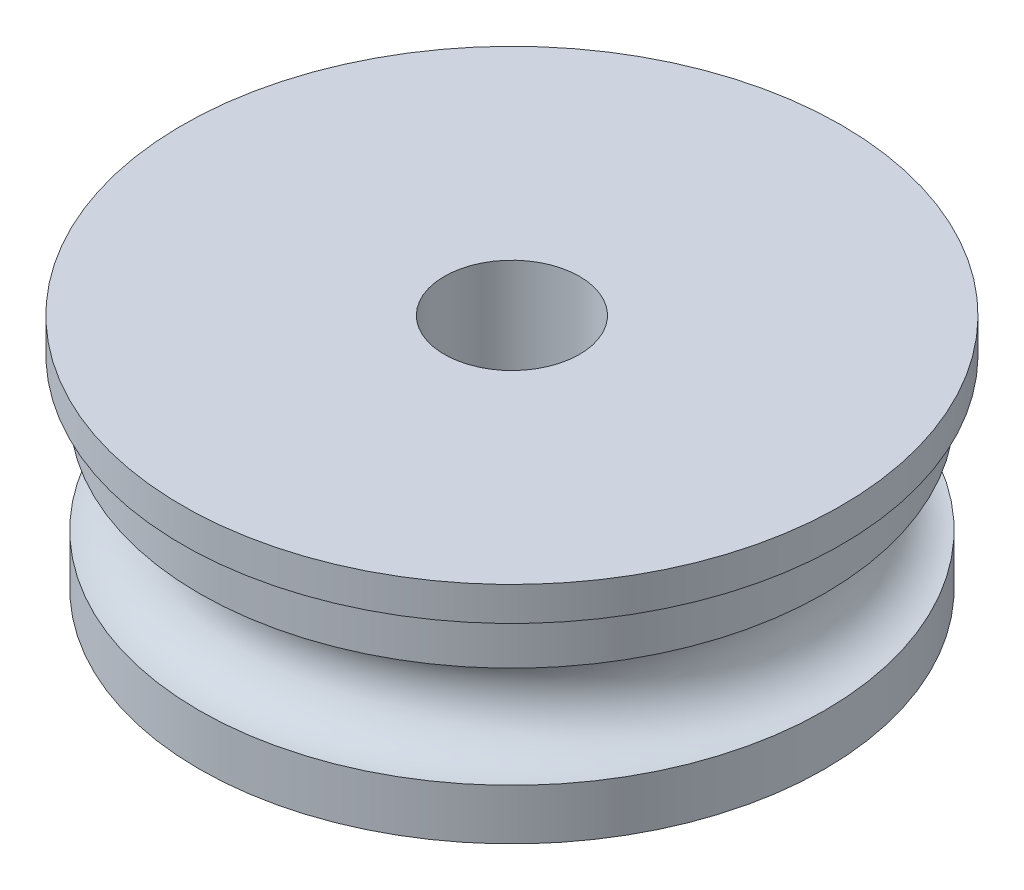
ISO-10303-21;
HEADER;
FILE_DESCRIPTION(('STEP AP214'),'2;1');
FILE_NAME('part.step','',(''),(''),'','','');
FILE_SCHEMA(('AUTOMOTIVE_DESIGN { 1 0 10303 214 1 1 1 1 }'));
ENDSEC;
DATA;
#1=APPLICATION_CONTEXT('core data for automotive mechanical design processes');
#2=APPLICATION_PROTOCOL_DEFINITION('international standard','automotive_design',2000,#1);
#3=PRODUCT_CONTEXT('',#1,'mechanical');
#4=PRODUCT('Part','Part','',(#3));
#5=PRODUCT_RELATED_PRODUCT_CATEGORY('part','',(#4));
#6=PRODUCT_DEFINITION_FORMATION('','',#4);
#7=PRODUCT_DEFINITION_CONTEXT('part definition',#1,'design');
#8=PRODUCT_DEFINITION('design','',#6,#7);
#9=PRODUCT_DEFINITION_SHAPE('','',#8);
#10=(LENGTH_UNIT() NAMED_UNIT(*) SI_UNIT(.MILLI.,.METRE.));
#11=(NAMED_UNIT(*) PLANE_ANGLE_UNIT() SI_UNIT($,.RADIAN.));
#12=(NAMED_UNIT(*) SI_UNIT($,.STERADIAN.) SOLID_ANGLE_UNIT());
#13=UNCERTAINTY_MEASURE_WITH_UNIT(LENGTH_MEASURE(1.E-05),#10,'distance_accuracy_value','');
#14=(GEOMETRIC_REPRESENTATION_CONTEXT(3) GLOBAL_UNCERTAINTY_ASSIGNED_CONTEXT((#13)) GLOBAL_UNIT_ASSIGNED_CONTEXT((#10,
#11,#12)) REPRESENTATION_CONTEXT('',''));
#15=CARTESIAN_POINT('',(0.,0.,0.));
#16=DIRECTION('',(0.,0.,1.));
#17=DIRECTION('',(1.,0.,0.));
#18=AXIS2_PLACEMENT_3D('',#15,#16,#17);
#19=CARTESIAN_POINT('',(6.,0.,0.));
#20=DIRECTION('',(0.,-1.,0.));
#21=DIRECTION('',(0.,0.,-1.));
#22=AXIS2_PLACEMENT_3D('',#19,#20,#21);
#23=PLANE('',#22);
#24=CARTESIAN_POINT('',(0.,0.,0.));
#25=DIRECTION('',(0.,-1.,0.));
#26=DIRECTION('',(0.,0.,-1.));
#27=AXIS2_PLACEMENT_3D('',#24,#25,#26);
#28=CIRCLE('',#27,6.);
#29=CARTESIAN_POINT('',(0.,0.,-6.));
#30=VERTEX_POINT('',#29);
#31=EDGE_CURVE('E10',#30,#30,#28,.T.);
#32=ORIENTED_EDGE('',*,*,#31,.T.);
#33=EDGE_LOOP('',(#32));
#34=FACE_BOUND('',#33,.T.);
#35=CARTESIAN_POINT('',(0.,0.,0.));
#36=DIRECTION('',(0.,-1.,0.));
#37=DIRECTION('',(0.,0.,-1.));
#38=AXIS2_PLACEMENT_3D('',#35,#36,#37);
#39=CIRCLE('',#38,2.);
#40=CARTESIAN_POINT('',(0.,0.,-2.));
#41=VERTEX_POINT('',#40);
#42=EDGE_CURVE('E65',#41,#41,#39,.T.);
#43=ORIENTED_EDGE('',*,*,#42,.F.);
#44=EDGE_LOOP('',(#43));
#45=FACE_BOUND('',#44,.T.);
#46=ADVANCED_FACE('F31',(#34,#45),#23,.T.);
#47=CARTESIAN_POINT('',(0.,0.,0.));
#48=DIRECTION('',(0.,-1.,0.));
#49=DIRECTION('',(0.,0.,-1.));
#50=AXIS2_PLACEMENT_3D('',#47,#48,#49);
#51=CYLINDRICAL_SURFACE('',#50,6.);
#52=CARTESIAN_POINT('',(0.,-3.,0.));
#53=DIRECTION('',(0.,-1.,0.));
#54=DIRECTION('',(0.,0.,-1.));
#55=AXIS2_PLACEMENT_3D('',#52,#53,#54);
#56=CIRCLE('',#55,6.);
#57=CARTESIAN_POINT('',(0.,-3.,-6.));
#58=VERTEX_POINT('',#57);
#59=EDGE_CURVE('E37',#58,#58,#56,.T.);
#60=ORIENTED_EDGE('',*,*,#59,.T.);
#61=EDGE_LOOP('',(#60));
#62=FACE_BOUND('',#61,.T.);
#63=ORIENTED_EDGE('',*,*,#31,.F.);
#64=EDGE_LOOP('',(#63));
#65=FACE_BOUND('',#64,.T.);
#66=ADVANCED_FACE('F73',(#62,#65),#51,.F.);
#67=CARTESIAN_POINT('',(9.25,-3.,0.));
#68=DIRECTION('',(0.,-1.,0.));
#69=DIRECTION('',(0.,0.,-1.));
#70=AXIS2_PLACEMENT_3D('',#67,#68,#69);
#71=PLANE('',#70);
#72=CARTESIAN_POINT('',(0.,-3.,0.));
#73=DIRECTION('',(0.,-1.,0.));
#74=DIRECTION('',(0.,0.,-1.));
#75=AXIS2_PLACEMENT_3D('',#72,#73,#74);
#76=CIRCLE('',#75,9.25);
#77=CARTESIAN_POINT('',(0.,-3.,-9.25));
#78=VERTEX_POINT('',#77);
#79=EDGE_CURVE('E41',#78,#78,#76,.T.);
#80=ORIENTED_EDGE('',*,*,#79,.T.);
#81=EDGE_LOOP('',(#80));
#82=FACE_BOUND('',#81,.T.);
#83=ORIENTED_EDGE('',*,*,#59,.F.);
#84=EDGE_LOOP('',(#83));
#85=FACE_BOUND('',#84,.T.);
#86=ADVANCED_FACE('F77',(#82,#85),#71,.T.);
#87=CARTESIAN_POINT('',(0.,0.,0.));
#88=DIRECTION('',(0.,-1.,0.));
#89=DIRECTION('',(0.,0.,-1.));
#90=AXIS2_PLACEMENT_3D('',#87,#88,#89);
#91=CYLINDRICAL_SURFACE('',#90,9.25);
#92=CARTESIAN_POINT('',(0.,-1.5,0.));
#93=DIRECTION('',(0.,-1.,0.));
#94=DIRECTION('',(0.,0.,-1.));
#95=AXIS2_PLACEMENT_3D('',#92,#93,#94);
#96=CIRCLE('',#95,9.25);
#97=CARTESIAN_POINT('',(0.,-1.5,-9.25));
#98=VERTEX_POINT('',#97);
#99=EDGE_CURVE('E45',#98,#98,#96,.T.);
#100=ORIENTED_EDGE('',*,*,#99,.T.);
#101=EDGE_LOOP('',(#100));
#102=FACE_BOUND('',#101,.T.);
#103=ORIENTED_EDGE('',*,*,#79,.F.);
#104=EDGE_LOOP('',(#103));
#105=FACE_BOUND('',#104,.T.);
#106=ADVANCED_FACE('F81',(#102,#105),#91,.T.);
#107=CARTESIAN_POINT('',(0.,0.,0.));
#108=DIRECTION('',(0.,-1.,0.));
#109=DIRECTION('',(0.,0.,-1.));
#110=AXIS2_PLACEMENT_3D('',#107,#108,#109);
#111=TOROIDAL_SURFACE('',#110,9.25,1.5);
#112=CARTESIAN_POINT('',(0.,1.5,0.));
#113=DIRECTION('',(0.,-1.,0.));
#114=DIRECTION('',(0.,0.,-1.));
#115=AXIS2_PLACEMENT_3D('',#112,#113,#114);
#116=CIRCLE('',#115,9.25);
#117=CARTESIAN_POINT('',(0.,1.5,-9.25));
#118=VERTEX_POINT('',#117);
#119=EDGE_CURVE('E50',#118,#118,#116,.T.);
#120=ORIENTED_EDGE('',*,*,#119,.T.);
#121=EDGE_LOOP('',(#120));
#122=FACE_BOUND('',#121,.T.);
#123=ORIENTED_EDGE('',*,*,#99,.F.);
#124=EDGE_LOOP('',(#123));
#125=FACE_BOUND('',#124,.T.);
#126=ADVANCED_FACE('F88',(#122,#125),#111,.F.);
#127=CARTESIAN_POINT('',(0.,0.,0.));
#128=DIRECTION('',(0.,-1.,0.));
#129=DIRECTION('',(0.,0.,-1.));
#130=AXIS2_PLACEMENT_3D('',#127,#128,#129);
#131=CYLINDRICAL_SURFACE('',#130,9.25);
#132=CARTESIAN_POINT('',(0.,3.,0.));
#133=DIRECTION('',(0.,-1.,0.));
#134=DIRECTION('',(0.,0.,-1.));
#135=AXIS2_PLACEMENT_3D('',#132,#133,#134);
#136=CIRCLE('',#135,9.25);
#137=CARTESIAN_POINT('',(0.,3.,-9.25));
#138=VERTEX_POINT('',#137);
#139=EDGE_CURVE('E53',#138,#138,#136,.T.);
#140=ORIENTED_EDGE('',*,*,#139,.T.);
#141=EDGE_LOOP('',(#140));
#142=FACE_BOUND('',#141,.T.);
#143=ORIENTED_EDGE('',*,*,#119,.F.);
#144=EDGE_LOOP('',(#143));
#145=FACE_BOUND('',#144,.T.);
#146=ADVANCED_FACE('F92',(#142,#145),#131,.T.);
#147=CARTESIAN_POINT('',(9.75,3.,0.));
#148=DIRECTION('',(0.,-1.,0.));
#149=DIRECTION('',(0.,0.,-1.));
#150=AXIS2_PLACEMENT_3D('',#147,#148,#149);
#151=PLANE('',#150);
#152=CARTESIAN_POINT('',(0.,3.,0.));
#153=DIRECTION('',(0.,-1.,0.));
#154=DIRECTION('',(0.,0.,-1.));
#155=AXIS2_PLACEMENT_3D('',#152,#153,#154);
#156=CIRCLE('',#155,9.75);
#157=CARTESIAN_POINT('',(0.,3.,-9.75));
#158=VERTEX_POINT('',#157);
#159=EDGE_CURVE('E56',#158,#158,#156,.T.);
#160=ORIENTED_EDGE('',*,*,#159,.T.);
#161=EDGE_LOOP('',(#160));
#162=FACE_BOUND('',#161,.T.);
#163=ORIENTED_EDGE('',*,*,#139,.F.);
#164=EDGE_LOOP('',(#163));
#165=FACE_BOUND('',#164,.T.);
#166=ADVANCED_FACE('F96',(#162,#165),#151,.T.);
#167=CARTESIAN_POINT('',(0.,0.,0.));
#168=DIRECTION('',(0.,-1.,0.));
#169=DIRECTION('',(0.,0.,-1.));
#170=AXIS2_PLACEMENT_3D('',#167,#168,#169);
#171=CYLINDRICAL_SURFACE('',#170,9.75);
#172=CARTESIAN_POINT('',(0.,4.,0.));
#173=DIRECTION('',(0.,-1.,0.));
#174=DIRECTION('',(0.,0.,-1.));
#175=AXIS2_PLACEMENT_3D('',#172,#173,#174);
#176=CIRCLE('',#175,9.75);
#177=CARTESIAN_POINT('',(0.,4.,-9.75));
#178=VERTEX_POINT('',#177);
#179=EDGE_CURVE('E59',#178,#178,#176,.T.);
#180=ORIENTED_EDGE('',*,*,#179,.T.);
#181=EDGE_LOOP('',(#180));
#182=FACE_BOUND('',#181,.T.);
#183=ORIENTED_EDGE('',*,*,#159,.F.);
#184=EDGE_LOOP('',(#183));
#185=FACE_BOUND('',#184,.T.);
#186=ADVANCED_FACE('F100',(#182,#185),#171,.T.);
#187=CARTESIAN_POINT('',(2.,4.,0.));
#188=DIRECTION('',(0.,1.,0.));
#189=DIRECTION('',(0.,0.,1.));
#190=AXIS2_PLACEMENT_3D('',#187,#188,#189);
#191=PLANE('',#190);
#192=CARTESIAN_POINT('',(0.,4.,0.));
#193=DIRECTION('',(0.,-1.,0.));
#194=DIRECTION('',(0.,0.,-1.));
#195=AXIS2_PLACEMENT_3D('',#192,#193,#194);
#196=CIRCLE('',#195,2.);
#197=CARTESIAN_POINT('',(0.,4.,-2.));
#198=VERTEX_POINT('',#197);
#199=EDGE_CURVE('E62',#198,#198,#196,.T.);
#200=ORIENTED_EDGE('',*,*,#199,.T.);
#201=EDGE_LOOP('',(#200));
#202=FACE_BOUND('',#201,.T.);
#203=ORIENTED_EDGE('',*,*,#179,.F.);
#204=EDGE_LOOP('',(#203));
#205=FACE_BOUND('',#204,.T.);
#206=ADVANCED_FACE('F104',(#202,#205),#191,.T.);
#207=CARTESIAN_POINT('',(0.,0.,0.));
#208=DIRECTION('',(0.,-1.,0.));
#209=DIRECTION('',(0.,0.,-1.));
#210=AXIS2_PLACEMENT_3D('',#207,#208,#209);
#211=CYLINDRICAL_SURFACE('',#210,2.);
#212=ORIENTED_EDGE('',*,*,#42,.T.);
#213=EDGE_LOOP('',(#212));
#214=FACE_BOUND('',#213,.T.);
#215=ORIENTED_EDGE('',*,*,#199,.F.);
#216=EDGE_LOOP('',(#215));
#217=FACE_BOUND('',#216,.T.);
#218=ADVANCED_FACE('F69',(#214,#217),#211,.F.);
#219=CLOSED_SHELL('',(#46,#66,#86,#106,#126,#146,#166,#186,#206,#218));
#220=MANIFOLD_SOLID_BREP('B2',#219);
#221=ADVANCED_BREP_SHAPE_REPRESENTATION('',(#18,#220),#14);
#222=SHAPE_DEFINITION_REPRESENTATION(#9,#221);
ENDSEC;
END-ISO-10303-21;
